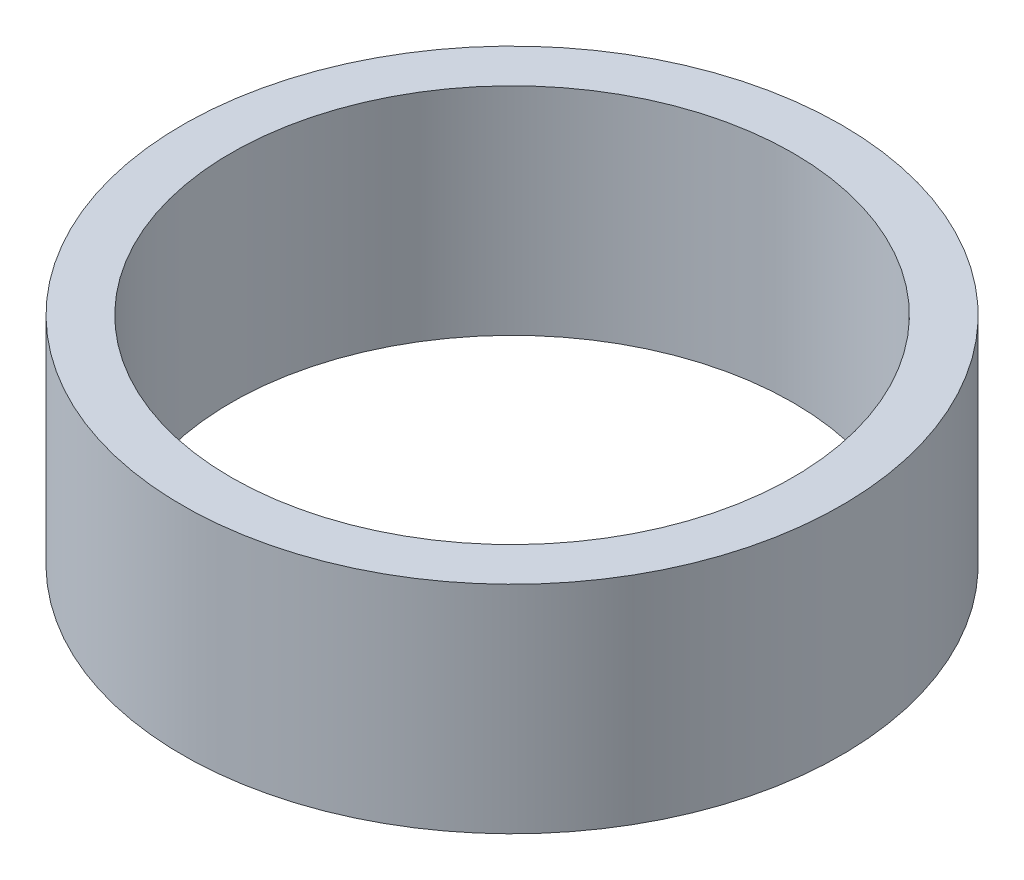
ISO-10303-21;
HEADER;
FILE_DESCRIPTION(('STEP AP214'),'2;1');
FILE_NAME('part.step','',(''),(''),'','','');
FILE_SCHEMA(('AUTOMOTIVE_DESIGN { 1 0 10303 214 1 1 1 1 }'));
ENDSEC;
DATA;
#1=APPLICATION_CONTEXT('core data for automotive mechanical design processes');
#2=APPLICATION_PROTOCOL_DEFINITION('international standard','automotive_design',2000,#1);
#3=PRODUCT_CONTEXT('',#1,'mechanical');
#4=PRODUCT('Part','Part','',(#3));
#5=PRODUCT_RELATED_PRODUCT_CATEGORY('part','',(#4));
#6=PRODUCT_DEFINITION_FORMATION('','',#4);
#7=PRODUCT_DEFINITION_CONTEXT('part definition',#1,'design');
#8=PRODUCT_DEFINITION('design','',#6,#7);
#9=PRODUCT_DEFINITION_SHAPE('','',#8);
#10=(LENGTH_UNIT() NAMED_UNIT(*) SI_UNIT(.MILLI.,.METRE.));
#11=(NAMED_UNIT(*) PLANE_ANGLE_UNIT() SI_UNIT($,.RADIAN.));
#12=(NAMED_UNIT(*) SI_UNIT($,.STERADIAN.) SOLID_ANGLE_UNIT());
#13=UNCERTAINTY_MEASURE_WITH_UNIT(LENGTH_MEASURE(1.E-05),#10,'distance_accuracy_value','');
#14=(GEOMETRIC_REPRESENTATION_CONTEXT(3) GLOBAL_UNCERTAINTY_ASSIGNED_CONTEXT((#13)) GLOBAL_UNIT_ASSIGNED_CONTEXT((#10,
#11,#12)) REPRESENTATION_CONTEXT('',''));
#15=CARTESIAN_POINT('',(0.,0.,0.));
#16=DIRECTION('',(0.,0.,1.));
#17=DIRECTION('',(1.,0.,0.));
#18=AXIS2_PLACEMENT_3D('',#15,#16,#17);
#19=CARTESIAN_POINT('',(0.,-8.,0.));
#20=DIRECTION('',(0.,-1.,0.));
#21=DIRECTION('',(0.,0.,-1.));
#22=AXIS2_PLACEMENT_3D('',#19,#20,#21);
#23=CYLINDRICAL_SURFACE('',#22,10.4);
#24=CARTESIAN_POINT('',(0.,-4.,0.));
#25=DIRECTION('',(0.,-1.,0.));
#26=DIRECTION('',(0.,0.,-1.));
#27=AXIS2_PLACEMENT_3D('',#24,#25,#26);
#28=CIRCLE('',#27,10.4);
#29=CARTESIAN_POINT('',(0.,-4.,-10.4));
#30=VERTEX_POINT('',#29);
#31=EDGE_CURVE('E10',#30,#30,#28,.T.);
#32=ORIENTED_EDGE('',*,*,#31,.T.);
#33=EDGE_LOOP('',(#32));
#34=FACE_BOUND('',#33,.T.);
#35=CARTESIAN_POINT('',(0.,4.,0.));
#36=DIRECTION('',(0.,-1.,0.));
#37=DIRECTION('',(0.,0.,-1.));
#38=AXIS2_PLACEMENT_3D('',#35,#36,#37);
#39=CIRCLE('',#38,10.4);
#40=CARTESIAN_POINT('',(0.,4.,-10.4));
#41=VERTEX_POINT('',#40);
#42=EDGE_CURVE('E45',#41,#41,#39,.T.);
#43=ORIENTED_EDGE('',*,*,#42,.F.);
#44=EDGE_LOOP('',(#43));
#45=FACE_BOUND('',#44,.T.);
#46=ADVANCED_FACE('F31',(#34,#45),#23,.F.);
#47=CARTESIAN_POINT('',(10.4,-4.,0.));
#48=DIRECTION('',(0.,-1.,0.));
#49=DIRECTION('',(0.,0.,-1.));
#50=AXIS2_PLACEMENT_3D('',#47,#48,#49);
#51=PLANE('',#50);
#52=CARTESIAN_POINT('',(0.,-4.,0.));
#53=DIRECTION('',(0.,-1.,0.));
#54=DIRECTION('',(0.,0.,-1.));
#55=AXIS2_PLACEMENT_3D('',#52,#53,#54);
#56=CIRCLE('',#55,12.2);
#57=CARTESIAN_POINT('',(0.,-4.,-12.2));
#58=VERTEX_POINT('',#57);
#59=EDGE_CURVE('E37',#58,#58,#56,.T.);
#60=ORIENTED_EDGE('',*,*,#59,.T.);
#61=EDGE_LOOP('',(#60));
#62=FACE_BOUND('',#61,.T.);
#63=ORIENTED_EDGE('',*,*,#31,.F.);
#64=EDGE_LOOP('',(#63));
#65=FACE_BOUND('',#64,.T.);
#66=ADVANCED_FACE('F55',(#62,#65),#51,.T.);
#67=CARTESIAN_POINT('',(0.,-8.,0.));
#68=DIRECTION('',(0.,-1.,0.));
#69=DIRECTION('',(0.,0.,-1.));
#70=AXIS2_PLACEMENT_3D('',#67,#68,#69);
#71=CYLINDRICAL_SURFACE('',#70,12.2);
#72=CARTESIAN_POINT('',(0.,4.,0.));
#73=DIRECTION('',(0.,-1.,0.));
#74=DIRECTION('',(0.,0.,-1.));
#75=AXIS2_PLACEMENT_3D('',#72,#73,#74);
#76=CIRCLE('',#75,12.2);
#77=CARTESIAN_POINT('',(0.,4.,-12.2));
#78=VERTEX_POINT('',#77);
#79=EDGE_CURVE('E41',#78,#78,#76,.T.);
#80=ORIENTED_EDGE('',*,*,#79,.T.);
#81=EDGE_LOOP('',(#80));
#82=FACE_BOUND('',#81,.T.);
#83=ORIENTED_EDGE('',*,*,#59,.F.);
#84=EDGE_LOOP('',(#83));
#85=FACE_BOUND('',#84,.T.);
#86=ADVANCED_FACE('F59',(#82,#85),#71,.T.);
#87=CARTESIAN_POINT('',(12.2,4.,0.));
#88=DIRECTION('',(0.,1.,0.));
#89=DIRECTION('',(0.,0.,1.));
#90=AXIS2_PLACEMENT_3D('',#87,#88,#89);
#91=PLANE('',#90);
#92=ORIENTED_EDGE('',*,*,#42,.T.);
#93=EDGE_LOOP('',(#92));
#94=FACE_BOUND('',#93,.T.);
#95=ORIENTED_EDGE('',*,*,#79,.F.);
#96=EDGE_LOOP('',(#95));
#97=FACE_BOUND('',#96,.T.);
#98=ADVANCED_FACE('F51',(#94,#97),#91,.T.);
#99=CLOSED_SHELL('',(#46,#66,#86,#98));
#100=MANIFOLD_SOLID_BREP('B2',#99);
#101=ADVANCED_BREP_SHAPE_REPRESENTATION('',(#18,#100),#14);
#102=SHAPE_DEFINITION_REPRESENTATION(#9,#101);
ENDSEC;
END-ISO-10303-21;
